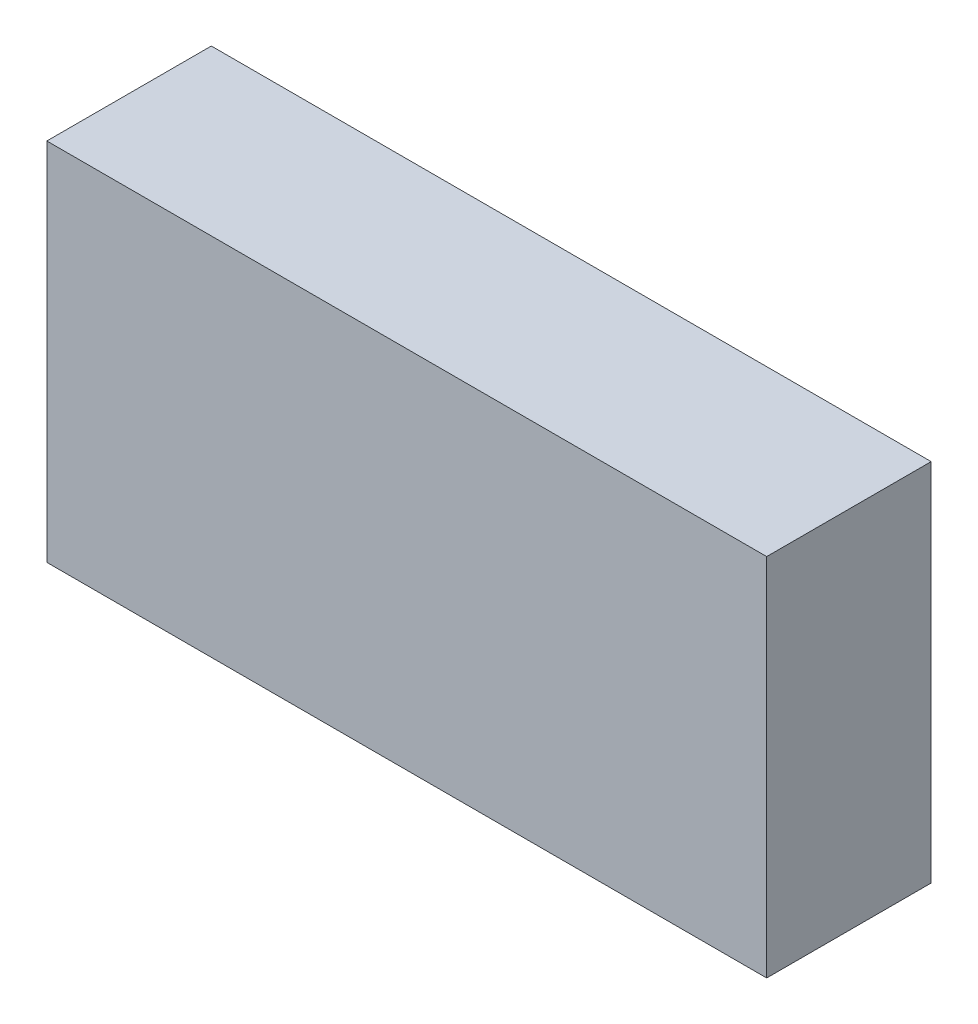
ISO-10303-21;
HEADER;
FILE_DESCRIPTION(('STEP AP214'),'2;1');
FILE_NAME('part.step','',(''),(''),'','','');
FILE_SCHEMA(('AUTOMOTIVE_DESIGN { 1 0 10303 214 1 1 1 1 }'));
ENDSEC;
DATA;
#1=APPLICATION_CONTEXT('core data for automotive mechanical design processes');
#2=APPLICATION_PROTOCOL_DEFINITION('international standard','automotive_design',2000,#1);
#3=PRODUCT_CONTEXT('',#1,'mechanical');
#4=PRODUCT('Part','Part','',(#3));
#5=PRODUCT_RELATED_PRODUCT_CATEGORY('part','',(#4));
#6=PRODUCT_DEFINITION_FORMATION('','',#4);
#7=PRODUCT_DEFINITION_CONTEXT('part definition',#1,'design');
#8=PRODUCT_DEFINITION('design','',#6,#7);
#9=PRODUCT_DEFINITION_SHAPE('','',#8);
#10=(LENGTH_UNIT() NAMED_UNIT(*) SI_UNIT(.MILLI.,.METRE.));
#11=(NAMED_UNIT(*) PLANE_ANGLE_UNIT() SI_UNIT($,.RADIAN.));
#12=(NAMED_UNIT(*) SI_UNIT($,.STERADIAN.) SOLID_ANGLE_UNIT());
#13=UNCERTAINTY_MEASURE_WITH_UNIT(LENGTH_MEASURE(1.E-05),#10,'distance_accuracy_value','');
#14=(GEOMETRIC_REPRESENTATION_CONTEXT(3) GLOBAL_UNCERTAINTY_ASSIGNED_CONTEXT((#13)) GLOBAL_UNIT_ASSIGNED_CONTEXT((#10,
#11,#12)) REPRESENTATION_CONTEXT('',''));
#15=CARTESIAN_POINT('',(0.,0.,0.));
#16=DIRECTION('',(0.,0.,1.));
#17=DIRECTION('',(1.,0.,0.));
#18=AXIS2_PLACEMENT_3D('',#15,#16,#17);
#19=CARTESIAN_POINT('',(0.,0.,0.457));
#20=DIRECTION('',(0.,0.,1.));
#21=DIRECTION('',(1.,0.,0.));
#22=AXIS2_PLACEMENT_3D('',#19,#20,#21);
#23=PLANE('',#22);
#24=DIRECTION('',(0.,1.,0.));
#25=VECTOR('',#24,1.);
#26=CARTESIAN_POINT('',(-1.,-0.075,0.457));
#27=LINE('',#26,#25);
#28=CARTESIAN_POINT('',(-1.,-0.507,0.457));
#29=VERTEX_POINT('',#28);
#30=CARTESIAN_POINT('',(-1.,0.507,0.457));
#31=VERTEX_POINT('',#30);
#32=EDGE_CURVE('E68',#29,#31,#27,.T.);
#33=ORIENTED_EDGE('',*,*,#32,.F.);
#34=DIRECTION('',(1.,0.,0.));
#35=VECTOR('',#34,1.);
#36=CARTESIAN_POINT('',(-1.,-0.507,0.457));
#37=LINE('',#36,#35);
#38=CARTESIAN_POINT('',(1.,-0.507,0.457));
#39=VERTEX_POINT('',#38);
#40=EDGE_CURVE('E20',#39,#29,#37,.F.);
#41=ORIENTED_EDGE('',*,*,#40,.F.);
#42=DIRECTION('',(0.,1.,0.));
#43=VECTOR('',#42,1.);
#44=CARTESIAN_POINT('',(1.,0.075,0.457));
#45=LINE('',#44,#43);
#46=CARTESIAN_POINT('',(1.,0.507,0.457));
#47=VERTEX_POINT('',#46);
#48=EDGE_CURVE('E58',#47,#39,#45,.F.);
#49=ORIENTED_EDGE('',*,*,#48,.F.);
#50=DIRECTION('',(1.,0.,0.));
#51=VECTOR('',#50,1.);
#52=CARTESIAN_POINT('',(1.,0.507,0.457));
#53=LINE('',#52,#51);
#54=EDGE_CURVE('E53',#31,#47,#53,.T.);
#55=ORIENTED_EDGE('',*,*,#54,.F.);
#56=EDGE_LOOP('',(#33,#41,#49,#55));
#57=FACE_BOUND('',#56,.T.);
#58=ADVANCED_FACE('F17',(#57),#23,.T.);
#59=CARTESIAN_POINT('',(-1.,-0.507,0.));
#60=DIRECTION('',(0.,-1.,0.));
#61=DIRECTION('',(0.,0.,-1.));
#62=AXIS2_PLACEMENT_3D('',#59,#60,#61);
#63=PLANE('',#62);
#64=DIRECTION('',(0.,0.,1.));
#65=VECTOR('',#64,1.);
#66=CARTESIAN_POINT('',(-1.,-0.507,0.));
#67=LINE('',#66,#65);
#68=CARTESIAN_POINT('',(-1.,-0.507,0.));
#69=VERTEX_POINT('',#68);
#70=EDGE_CURVE('E80',#69,#29,#67,.T.);
#71=ORIENTED_EDGE('',*,*,#70,.F.);
#72=DIRECTION('',(1.,0.,0.));
#73=VECTOR('',#72,1.);
#74=CARTESIAN_POINT('',(0.,-0.507,0.));
#75=LINE('',#74,#73);
#76=CARTESIAN_POINT('',(1.,-0.507,0.));
#77=VERTEX_POINT('',#76);
#78=EDGE_CURVE('E75',#69,#77,#75,.T.);
#79=ORIENTED_EDGE('',*,*,#78,.T.);
#80=DIRECTION('',(0.,0.,-1.));
#81=VECTOR('',#80,1.);
#82=CARTESIAN_POINT('',(1.,-0.507,0.));
#83=LINE('',#82,#81);
#84=EDGE_CURVE('E62',#39,#77,#83,.T.);
#85=ORIENTED_EDGE('',*,*,#84,.F.);
#86=ORIENTED_EDGE('',*,*,#40,.T.);
#87=EDGE_LOOP('',(#71,#79,#85,#86));
#88=FACE_BOUND('',#87,.T.);
#89=ADVANCED_FACE('F73',(#88),#63,.T.);
#90=CARTESIAN_POINT('',(1.,0.075,0.));
#91=DIRECTION('',(1.,0.,0.));
#92=DIRECTION('',(0.,0.,-1.));
#93=AXIS2_PLACEMENT_3D('',#90,#91,#92);
#94=PLANE('',#93);
#95=ORIENTED_EDGE('',*,*,#48,.T.);
#96=ORIENTED_EDGE('',*,*,#84,.T.);
#97=DIRECTION('',(0.,1.,0.));
#98=VECTOR('',#97,1.);
#99=CARTESIAN_POINT('',(1.,0.,0.));
#100=LINE('',#99,#98);
#101=CARTESIAN_POINT('',(1.,0.507,0.));
#102=VERTEX_POINT('',#101);
#103=EDGE_CURVE('E84',#77,#102,#100,.T.);
#104=ORIENTED_EDGE('',*,*,#103,.T.);
#105=DIRECTION('',(0.,0.,1.));
#106=VECTOR('',#105,1.);
#107=CARTESIAN_POINT('',(1.,0.507,0.));
#108=LINE('',#107,#106);
#109=EDGE_CURVE('E64',#47,#102,#108,.F.);
#110=ORIENTED_EDGE('',*,*,#109,.F.);
#111=EDGE_LOOP('',(#95,#96,#104,#110));
#112=FACE_BOUND('',#111,.T.);
#113=ADVANCED_FACE('F60',(#112),#94,.T.);
#114=CARTESIAN_POINT('',(1.,0.507,0.));
#115=DIRECTION('',(0.,1.,0.));
#116=DIRECTION('',(0.,0.,1.));
#117=AXIS2_PLACEMENT_3D('',#114,#115,#116);
#118=PLANE('',#117);
#119=ORIENTED_EDGE('',*,*,#109,.T.);
#120=DIRECTION('',(1.,0.,0.));
#121=VECTOR('',#120,1.);
#122=CARTESIAN_POINT('',(0.,0.507,0.));
#123=LINE('',#122,#121);
#124=CARTESIAN_POINT('',(-1.,0.507,0.));
#125=VERTEX_POINT('',#124);
#126=EDGE_CURVE('E26',#102,#125,#123,.F.);
#127=ORIENTED_EDGE('',*,*,#126,.T.);
#128=DIRECTION('',(0.,0.,1.));
#129=VECTOR('',#128,1.);
#130=CARTESIAN_POINT('',(-1.,0.507,0.));
#131=LINE('',#130,#129);
#132=EDGE_CURVE('E34',#31,#125,#131,.F.);
#133=ORIENTED_EDGE('',*,*,#132,.F.);
#134=ORIENTED_EDGE('',*,*,#54,.T.);
#135=EDGE_LOOP('',(#119,#127,#133,#134));
#136=FACE_BOUND('',#135,.T.);
#137=ADVANCED_FACE('F88',(#136),#118,.T.);
#138=CARTESIAN_POINT('',(-1.,-0.075,0.));
#139=DIRECTION('',(-1.,0.,0.));
#140=DIRECTION('',(0.,0.,1.));
#141=AXIS2_PLACEMENT_3D('',#138,#139,#140);
#142=PLANE('',#141);
#143=ORIENTED_EDGE('',*,*,#32,.T.);
#144=ORIENTED_EDGE('',*,*,#132,.T.);
#145=DIRECTION('',(0.,1.,0.));
#146=VECTOR('',#145,1.);
#147=CARTESIAN_POINT('',(-1.,0.,0.));
#148=LINE('',#147,#146);
#149=EDGE_CURVE('E11',#125,#69,#148,.F.);
#150=ORIENTED_EDGE('',*,*,#149,.T.);
#151=ORIENTED_EDGE('',*,*,#70,.T.);
#152=EDGE_LOOP('',(#143,#144,#150,#151));
#153=FACE_BOUND('',#152,.T.);
#154=ADVANCED_FACE('F91',(#153),#142,.T.);
#155=CARTESIAN_POINT('',(0.,0.,0.));
#156=DIRECTION('',(0.,0.,1.));
#157=DIRECTION('',(1.,0.,0.));
#158=AXIS2_PLACEMENT_3D('',#155,#156,#157);
#159=PLANE('',#158);
#160=ORIENTED_EDGE('',*,*,#78,.F.);
#161=ORIENTED_EDGE('',*,*,#149,.F.);
#162=ORIENTED_EDGE('',*,*,#126,.F.);
#163=ORIENTED_EDGE('',*,*,#103,.F.);
#164=EDGE_LOOP('',(#160,#161,#162,#163));
#165=FACE_BOUND('',#164,.T.);
#166=ADVANCED_FACE('F90',(#165),#159,.F.);
#167=CLOSED_SHELL('',(#58,#89,#113,#137,#154,#166));
#168=MANIFOLD_SOLID_BREP('B1',#167);
#169=ADVANCED_BREP_SHAPE_REPRESENTATION('',(#18,#168),#14);
#170=SHAPE_DEFINITION_REPRESENTATION(#9,#169);
ENDSEC;
END-ISO-10303-21;
